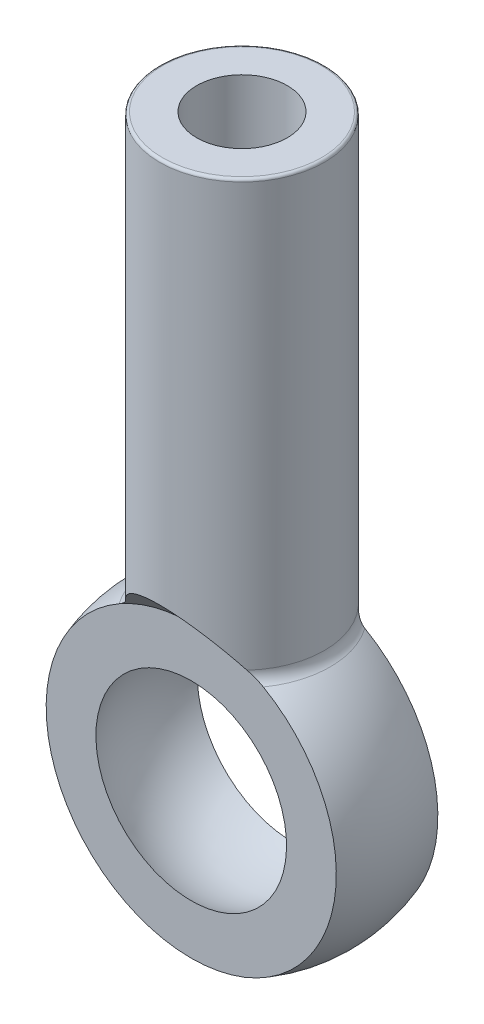
ISO-10303-21;
HEADER;
FILE_DESCRIPTION(('STEP AP214'),'2;1');
FILE_NAME('part.step','',(''),(''),'','','');
FILE_SCHEMA(('AUTOMOTIVE_DESIGN { 1 0 10303 214 1 1 1 1 }'));
ENDSEC;
DATA;
#1=APPLICATION_CONTEXT('core data for automotive mechanical design processes');
#2=APPLICATION_PROTOCOL_DEFINITION('international standard','automotive_design',2000,#1);
#3=PRODUCT_CONTEXT('',#1,'mechanical');
#4=PRODUCT('Part','Part','',(#3));
#5=PRODUCT_RELATED_PRODUCT_CATEGORY('part','',(#4));
#6=PRODUCT_DEFINITION_FORMATION('','',#4);
#7=PRODUCT_DEFINITION_CONTEXT('part definition',#1,'design');
#8=PRODUCT_DEFINITION('design','',#6,#7);
#9=PRODUCT_DEFINITION_SHAPE('','',#8);
#10=(LENGTH_UNIT() NAMED_UNIT(*) SI_UNIT(.MILLI.,.METRE.));
#11=(NAMED_UNIT(*) PLANE_ANGLE_UNIT() SI_UNIT($,.RADIAN.));
#12=(NAMED_UNIT(*) SI_UNIT($,.STERADIAN.) SOLID_ANGLE_UNIT());
#13=UNCERTAINTY_MEASURE_WITH_UNIT(LENGTH_MEASURE(1.E-05),#10,'distance_accuracy_value','');
#14=(GEOMETRIC_REPRESENTATION_CONTEXT(3) GLOBAL_UNCERTAINTY_ASSIGNED_CONTEXT((#13)) GLOBAL_UNIT_ASSIGNED_CONTEXT((#10,
#11,#12)) REPRESENTATION_CONTEXT('',''));
#15=CARTESIAN_POINT('',(0.,0.,0.));
#16=DIRECTION('',(0.,0.,1.));
#17=DIRECTION('',(1.,0.,0.));
#18=AXIS2_PLACEMENT_3D('',#15,#16,#17);
#19=CARTESIAN_POINT('',(0.,-5.60100000000002,0.));
#20=DIRECTION('',(0.,1.,0.));
#21=DIRECTION('',(0.,0.,1.));
#22=AXIS2_PLACEMENT_3D('',#19,#20,#21);
#23=CYLINDRICAL_SURFACE('',#22,3.);
#24=CARTESIAN_POINT('',(0.,20.4,0.));
#25=DIRECTION('',(0.,1.,0.));
#26=DIRECTION('',(0.,0.,1.));
#27=AXIS2_PLACEMENT_3D('',#24,#25,#26);
#28=CIRCLE('',#27,3.);
#29=CARTESIAN_POINT('',(0.,20.4,3.));
#30=VERTEX_POINT('',#29);
#31=EDGE_CURVE('E193',#30,#30,#28,.F.);
#32=ORIENTED_EDGE('',*,*,#31,.T.);
#33=EDGE_LOOP('',(#32));
#34=FACE_BOUND('',#33,.T.);
#35=CARTESIAN_POINT('',(2.44602412682537,4.55764042091961,-1.73694155658394));
#36=CARTESIAN_POINT('',(2.40024699118172,4.65528738705973,-1.80135420225148));
#37=CARTESIAN_POINT('',(2.35107082688438,4.75176667393299,-1.8652601699289));
#38=CARTESIAN_POINT('',(2.24504764663498,4.94192204966051,-1.99164213423625));
#39=CARTESIAN_POINT('',(2.18817632060194,5.03558805605593,-2.05411283373368));
#40=CARTESIAN_POINT('',(2.065388779281,5.22019216431228,-2.17757534889617));
#41=CARTESIAN_POINT('',(1.9993651671368,5.31107936578248,-2.23853761703539));
#42=CARTESIAN_POINT('',(1.85807132661981,5.48748542198404,-2.35713248808425));
#43=CARTESIAN_POINT('',(1.78281428518668,5.57301167511847,-2.41476967063122));
#44=CARTESIAN_POINT('',(1.61727835978782,5.74198420783052,-2.52885273648694));
#45=CARTESIAN_POINT('',(1.52637597661213,5.82501167258094,-2.5850287621427));
#46=CARTESIAN_POINT('',(1.33223674939199,5.98025978098959,-2.69022793969352));
#47=CARTESIAN_POINT('',(1.22902332123154,6.05250037003263,-2.73926428885861));
#48=CARTESIAN_POINT('',(1.00785215259881,6.18334202748633,-2.82817579205946));
#49=CARTESIAN_POINT('',(0.889693567413791,6.24171829613962,-2.86789983612999));
#50=CARTESIAN_POINT('',(0.703876593955193,6.31376845861247,-2.91696200747435));
#51=CARTESIAN_POINT('',(0.640551249727053,6.33519066779155,-2.93155606918036));
#52=CARTESIAN_POINT('',(0.511484936846344,6.37224502719385,-2.95680640498372));
#53=CARTESIAN_POINT('',(0.445745232155979,6.38788016086986,-2.96746470810444));
#54=CARTESIAN_POINT('',(0.28505371296226,6.41789123734155,-2.98792594289107));
#55=CARTESIAN_POINT('',(0.18919987239285,6.42910892861182,-2.99557716349875));
#56=CARTESIAN_POINT('',(-0.00338252106644028,6.43785863240115,-3.00154480540944));
#57=CARTESIAN_POINT('',(-0.100110772347433,6.43539519664305,-2.99986433137538));
#58=CARTESIAN_POINT('',(-0.291482826134028,6.41703538830415,-2.98734323740458));
#59=CARTESIAN_POINT('',(-0.386129936671219,6.4011621962858,-2.97651842468568));
#60=CARTESIAN_POINT('',(-0.571186897211008,6.3572962402258,-2.94661794994415));
#61=CARTESIAN_POINT('',(-0.661593999382848,6.32929573388685,-2.92753701707234));
#62=CARTESIAN_POINT('',(-0.868663474402699,6.25087803409788,-2.87413503269833));
#63=CARTESIAN_POINT('',(-0.982853168539536,6.19600855473055,-2.83679302201911));
#64=CARTESIAN_POINT('',(-1.19912288765179,6.07182904256509,-2.75239124631842));
#65=CARTESIAN_POINT('',(-1.30117579428091,6.00248759124179,-2.70531034024588));
#66=CARTESIAN_POINT('',(-1.54412887500798,5.81386312608104,-2.5774505778385));
#67=CARTESIAN_POINT('',(-1.67706056407422,5.68755209964437,-2.49201138082646));
#68=CARTESIAN_POINT('',(-1.91850373352036,5.41947818060445,-2.31131222685422));
#69=CARTESIAN_POINT('',(-2.0269413616641,5.27767042171176,-2.21602379987247));
#70=CARTESIAN_POINT('',(-2.18642804189703,5.03841487166648,-2.05599898054649));
#71=CARTESIAN_POINT('',(-2.24387021045847,4.94395556214009,-1.9929955287411));
#72=CARTESIAN_POINT('',(-2.35065088855696,4.75259605133688,-1.86580957838995));
#73=CARTESIAN_POINT('',(-2.40004907213855,4.6557206143549,-1.80164009762895));
#74=CARTESIAN_POINT('',(-2.44602412682537,4.55764042091961,-1.73694155658455));
#75=B_SPLINE_CURVE_WITH_KNOTS('',3,(#35,#36,#37,#38,#39,#40,#41,#42,#43,#44,#45,#46,#47,#48,#49,
#50,#51,#52,#53,#54,#55,#56,#57,#58,#59,#60,#61,#62,#63,#64,#65,#66,#67,#68,#69,#70,#71,#72,#73,
#74),.UNSPECIFIED.,.F.,.F.,(4,2,2,2,2,2,2,2,2,2,2,2,2,2,2,2,2,2,2,4),(0.,0.376902116192524,
0.755023998504271,1.13803272365104,1.52050067769538,1.92548327434444,2.32970751299637,
2.7400960849395,2.94502683597151,3.14985178993383,3.43885430817985,3.72776068079855,
4.01616865948594,4.30476103508917,4.69877211254722,5.09364765232536,5.69718424084918,
6.30251696324926,6.68399467053855,7.06249895359513),.UNSPECIFIED.);
#76=CARTESIAN_POINT('',(2.21092766784287,4.99599839871873,-2.02775709777253));
#77=VERTEX_POINT('',#76);
#78=CARTESIAN_POINT('',(-2.21092766784342,4.995998398718,-2.0277570977727));
#79=VERTEX_POINT('',#78);
#80=EDGE_CURVE('E99',#77,#79,#75,.T.);
#81=ORIENTED_EDGE('',*,*,#80,.T.);
#82=CARTESIAN_POINT('',(0.,4.99599839871873,0.));
#83=DIRECTION('',(0.,-1.,0.));
#84=DIRECTION('',(0.,0.,-1.));
#85=AXIS2_PLACEMENT_3D('',#82,#83,#84);
#86=CIRCLE('',#85,3.);
#87=CARTESIAN_POINT('',(-2.21092766784342,4.995998398718,2.02775709777137));
#88=VERTEX_POINT('',#87);
#89=EDGE_CURVE('E186',#79,#88,#86,.F.);
#90=ORIENTED_EDGE('',*,*,#89,.T.);
#91=CARTESIAN_POINT('',(2.44602412682537,4.55764042091961,1.73694155658388));
#92=CARTESIAN_POINT('',(2.40024699118172,4.65528738705971,1.80135420225145));
#93=CARTESIAN_POINT('',(2.35107082688439,4.75176667393297,1.86526016992887));
#94=CARTESIAN_POINT('',(2.245047646635,4.94192204966048,1.99164213423623));
#95=CARTESIAN_POINT('',(2.18817632060196,5.03558805605589,2.05411283373366));
#96=CARTESIAN_POINT('',(2.06538877928102,5.22019216431225,2.17757534889615));
#97=CARTESIAN_POINT('',(1.99936516713682,5.31107936578245,2.23853761703538));
#98=CARTESIAN_POINT('',(1.85807132661981,5.48748542198403,2.35713248808425));
#99=CARTESIAN_POINT('',(1.78281428518668,5.57301167511847,2.41476967063121));
#100=CARTESIAN_POINT('',(1.61727835978782,5.74198420783052,2.52885273648694));
#101=CARTESIAN_POINT('',(1.52637597661214,5.82501167258092,2.5850287621427));
#102=CARTESIAN_POINT('',(1.33223674939201,5.98025978098958,2.6902279396935));
#103=CARTESIAN_POINT('',(1.22902332123158,6.05250037003263,2.73926428885856));
#104=CARTESIAN_POINT('',(1.00785215259886,6.18334202748633,2.82817579205941));
#105=CARTESIAN_POINT('',(0.889693567413841,6.2417182961396,2.86789983612996));
#106=CARTESIAN_POINT('',(0.703876593955234,6.31376845861245,2.91696200747435));
#107=CARTESIAN_POINT('',(0.640551249727088,6.33519066779154,2.93155606918036));
#108=CARTESIAN_POINT('',(0.511484936846363,6.37224502719385,2.95680640498371));
#109=CARTESIAN_POINT('',(0.445745232155989,6.38788016086986,2.96746470810444));
#110=CARTESIAN_POINT('',(0.285053712962261,6.41789123734155,2.98792594289107));
#111=CARTESIAN_POINT('',(0.189199872392848,6.42910892861182,2.99557716349877));
#112=CARTESIAN_POINT('',(-0.00338252106641402,6.43785863240115,3.00154480540942));
#113=CARTESIAN_POINT('',(-0.100110772347376,6.43539519664305,2.99986433137529));
#114=CARTESIAN_POINT('',(-0.291482826134026,6.41703538830414,2.98734323740466));
#115=CARTESIAN_POINT('',(-0.3861299366713,6.40116219628577,2.97651842468599));
#116=CARTESIAN_POINT('',(-0.571186897211041,6.35729624022579,2.94661794994382));
#117=CARTESIAN_POINT('',(-0.661593999382749,6.32929573388689,2.92753701707113));
#118=CARTESIAN_POINT('',(-0.868663474402666,6.25087803409785,2.87413503269684));
#119=CARTESIAN_POINT('',(-0.982853168539857,6.19600855473035,2.83679302201887));
#120=CARTESIAN_POINT('',(-1.19912288765214,6.07182904256491,2.7523912463184));
#121=CARTESIAN_POINT('',(-1.30117579428093,6.00248759124179,2.70531034024481));
#122=CARTESIAN_POINT('',(-1.5441288750078,5.81386312608105,2.57745057783676));
#123=CARTESIAN_POINT('',(-1.67706056407451,5.68755209964398,2.49201138082612));
#124=CARTESIAN_POINT('',(-1.91850373352072,5.41947818060411,2.31131222685407));
#125=CARTESIAN_POINT('',(-2.02694136166408,5.27767042171188,2.21602379987109));
#126=CARTESIAN_POINT('',(-2.18642804189705,5.03841487166641,2.05599898054528));
#127=CARTESIAN_POINT('',(-2.24387021045866,4.94395556213973,1.99299552874049));
#128=CARTESIAN_POINT('',(-2.35065088855731,4.75259605133626,1.8658095783899));
#129=CARTESIAN_POINT('',(-2.4000490721389,4.65572061435432,1.80164009762886));
#130=CARTESIAN_POINT('',(-2.44602412682537,4.55764042091961,1.73694155658327));
#131=B_SPLINE_CURVE_WITH_KNOTS('',3,(#91,#92,#93,#94,#95,#96,#97,#98,#99,#100,#101,#102,#103,
#104,#105,#106,#107,#108,#109,#110,#111,#112,#113,#114,#115,#116,#117,#118,#119,#120,#121,#122,
#123,#124,#125,#126,#127,#128,#129,#130),.UNSPECIFIED.,.F.,.F.,(4,2,2,2,2,2,2,2,2,2,2,2,2,2,2,2,
2,2,2,4),(0.,0.376902116192513,0.755023998504251,1.13803272365105,1.5205006776954,
1.92548327434445,2.32970751299633,2.74009608493947,2.94502683597151,3.14985178993386,
3.43885430817987,3.72776068079852,4.01616865948602,4.30476103508941,4.69877211254755,
5.0936476523257,5.69718424084952,6.30251696324968,6.683994670539,7.06249895359556),.UNSPECIFIED.);
#132=CARTESIAN_POINT('',(2.21092766784287,4.99599839871873,2.02775709777253));
#133=VERTEX_POINT('',#132);
#134=EDGE_CURVE('E103',#133,#88,#131,.T.);
#135=ORIENTED_EDGE('',*,*,#134,.F.);
#136=CARTESIAN_POINT('',(0.,4.99599839871873,0.));
#137=DIRECTION('',(0.,-1.,0.));
#138=DIRECTION('',(0.,0.,-1.));
#139=AXIS2_PLACEMENT_3D('',#136,#137,#138);
#140=CIRCLE('',#139,3.);
#141=EDGE_CURVE('E189',#133,#77,#140,.F.);
#142=ORIENTED_EDGE('',*,*,#141,.T.);
#143=EDGE_LOOP('',(#81,#90,#135,#142));
#144=FACE_BOUND('',#143,.T.);
#145=ADVANCED_FACE('F48',(#34,#144),#23,.T.);
#146=CARTESIAN_POINT('',(0.,0.,0.));
#147=DIRECTION('',(0.,0.,1.));
#148=DIRECTION('',(0.,1.,0.));
#149=AXIS2_PLACEMENT_3D('',#146,#147,#148);
#150=SPHERICAL_SURFACE('',#149,5.6);
#151=CARTESIAN_POINT('',(0.,0.,1.85000000000002));
#152=DIRECTION('',(0.,0.,1.));
#153=DIRECTION('',(1.,0.,0.));
#154=AXIS2_PLACEMENT_3D('',#151,#152,#153);
#155=CIRCLE('',#154,5.2855936279665);
#156=CARTESIAN_POINT('',(-2.62709086691049,4.58649033324998,1.84999999999935));
#157=VERTEX_POINT('',#156);
#158=CARTESIAN_POINT('',(2.62709086691049,4.58649033324998,1.85000000000002));
#159=VERTEX_POINT('',#158);
#160=EDGE_CURVE('E206',#157,#159,#155,.T.);
#161=ORIENTED_EDGE('',*,*,#160,.F.);
#162=CARTESIAN_POINT('',(0.,4.58649033324998,0.));
#163=DIRECTION('',(0.,-1.,0.));
#164=DIRECTION('',(0.,0.,-1.));
#165=AXIS2_PLACEMENT_3D('',#162,#163,#164);
#166=CIRCLE('',#165,3.21311475409836);
#167=CARTESIAN_POINT('',(-2.62709086691049,4.58649033324998,-1.85000000000068));
#168=VERTEX_POINT('',#167);
#169=EDGE_CURVE('E185',#157,#168,#166,.T.);
#170=ORIENTED_EDGE('',*,*,#169,.T.);
#171=CARTESIAN_POINT('',(0.,0.,-1.85000000000002));
#172=DIRECTION('',(0.,0.,1.));
#173=DIRECTION('',(1.,0.,0.));
#174=AXIS2_PLACEMENT_3D('',#171,#172,#173);
#175=CIRCLE('',#174,5.2855936279665);
#176=CARTESIAN_POINT('',(2.62709086691049,4.58649033324998,-1.85000000000002));
#177=VERTEX_POINT('',#176);
#178=EDGE_CURVE('E199',#168,#177,#175,.T.);
#179=ORIENTED_EDGE('',*,*,#178,.T.);
#180=CARTESIAN_POINT('',(0.,4.58649033324998,0.));
#181=DIRECTION('',(0.,-1.,0.));
#182=DIRECTION('',(0.,0.,-1.));
#183=AXIS2_PLACEMENT_3D('',#180,#181,#182);
#184=CIRCLE('',#183,3.21311475409836);
#185=EDGE_CURVE('E182',#177,#159,#184,.T.);
#186=ORIENTED_EDGE('',*,*,#185,.T.);
#187=EDGE_LOOP('',(#161,#170,#179,#186));
#188=FACE_BOUND('',#187,.T.);
#189=ADVANCED_FACE('F131',(#188),#150,.T.);
#190=CARTESIAN_POINT('',(0.,3.47299942412893,-1.85000000000002));
#191=DIRECTION('',(0.,0.,1.));
#192=DIRECTION('',(1.,0.,0.));
#193=AXIS2_PLACEMENT_3D('',#190,#191,#192);
#194=PLANE('',#193);
#195=EDGE_CURVE('E68',#177,#168,#175,.T.);
#196=ORIENTED_EDGE('',*,*,#195,.F.);
#197=ORIENTED_EDGE('',*,*,#178,.F.);
#198=EDGE_LOOP('',(#196,#197));
#199=FACE_BOUND('',#198,.T.);
#200=CARTESIAN_POINT('',(0.,0.,-1.85000000000002));
#201=DIRECTION('',(0.,0.,1.));
#202=DIRECTION('',(1.,0.,0.));
#203=AXIS2_PLACEMENT_3D('',#200,#201,#202);
#204=CIRCLE('',#203,3.47299942412895);
#205=CARTESIAN_POINT('',(0.,3.47299942412894,-1.85000000000002));
#206=VERTEX_POINT('',#205);
#207=EDGE_CURVE('E200',#206,#206,#204,.T.);
#208=ORIENTED_EDGE('',*,*,#207,.T.);
#209=EDGE_LOOP('',(#208));
#210=FACE_BOUND('',#209,.T.);
#211=ADVANCED_FACE('F137',(#199,#210),#194,.F.);
#212=CARTESIAN_POINT('',(0.,0.,0.));
#213=DIRECTION('',(0.,0.,1.));
#214=DIRECTION('',(0.,1.,0.));
#215=AXIS2_PLACEMENT_3D('',#212,#213,#214);
#216=SPHERICAL_SURFACE('',#215,3.935);
#217=CARTESIAN_POINT('',(0.,0.,1.85000000000002));
#218=DIRECTION('',(0.,0.,1.));
#219=DIRECTION('',(1.,0.,0.));
#220=AXIS2_PLACEMENT_3D('',#217,#218,#219);
#221=CIRCLE('',#220,3.47299942412895);
#222=CARTESIAN_POINT('',(0.,3.47299942412894,1.85000000000002));
#223=VERTEX_POINT('',#222);
#224=EDGE_CURVE('E203',#223,#223,#221,.T.);
#225=CARTESIAN_POINT('',(0.,3.47299942412894,-1.85000000000002));
#226=CARTESIAN_POINT('',(0.,3.49186379439191,-1.81458641304172));
#227=CARTESIAN_POINT('',(0.,3.51018613981897,-1.77888411225705));
#228=CARTESIAN_POINT('',(0.,3.54573044864856,-1.70693589121255));
#229=CARTESIAN_POINT('',(0.,3.56295241205111,-1.67068997095273));
#230=CARTESIAN_POINT('',(0.,3.59627962447903,-1.59768831913556));
#231=CARTESIAN_POINT('',(0.,3.61238487350441,-1.56093258757822));
#232=CARTESIAN_POINT('',(0.,3.64346364563702,-1.48694573467696));
#233=CARTESIAN_POINT('',(0.,3.65843716874426,-1.44971461333305));
#234=CARTESIAN_POINT('',(0.,3.68723846254222,-1.37481181067575));
#235=CARTESIAN_POINT('',(0.,3.70106623323295,-1.33714012936236));
#236=CARTESIAN_POINT('',(0.,3.72756308759968,-1.26139145860531));
#237=CARTESIAN_POINT('',(0.,3.74023217127567,-1.22331446916166));
#238=CARTESIAN_POINT('',(0.,3.76439979590223,-1.14679081061212));
#239=CARTESIAN_POINT('',(0.,3.7758983368528,-1.10834414150624));
#240=CARTESIAN_POINT('',(0.,3.79771411702859,-1.03111709871584));
#241=CARTESIAN_POINT('',(0.,3.80803135625382,-0.992336725031327));
#242=CARTESIAN_POINT('',(0.,3.82747487895382,-0.914478560229745));
#243=CARTESIAN_POINT('',(0.,3.83660116242861,-0.875400769112676));
#244=CARTESIAN_POINT('',(0.,3.85365423409406,-0.796984334938983));
#245=CARTESIAN_POINT('',(0.,3.86158102228472,-0.757645691882359));
#246=CARTESIAN_POINT('',(0.,3.87622768620067,-0.678744363390825));
#247=CARTESIAN_POINT('',(0.,3.88294756192595,-0.639181677955915));
#248=CARTESIAN_POINT('',(0.,3.89517411305735,-0.559869283911408));
#249=CARTESIAN_POINT('',(0.,3.90068078846348,-0.520119575301811));
#250=CARTESIAN_POINT('',(0.,3.91047578630457,-0.440470329110024));
#251=CARTESIAN_POINT('',(0.,3.91476410873953,-0.400570791527834));
#252=CARTESIAN_POINT('',(0.,3.92211838801197,-0.320659221789693));
#253=CARTESIAN_POINT('',(0.,3.92518434484943,-0.280647189633742));
#254=CARTESIAN_POINT('',(0.,3.93009102408018,-0.200548070409145));
#255=CARTESIAN_POINT('',(0.,3.93193174647346,-0.160460983340499));
#256=CARTESIAN_POINT('',(0.,3.93438623443337,-0.0802492641812358));
#257=CARTESIAN_POINT('',(0.,3.935,-0.0401246320906178));
#258=CARTESIAN_POINT('',(0.,3.935,0.0401246320906182));
#259=CARTESIAN_POINT('',(0.,3.93438623443337,0.0802492641812361));
#260=CARTESIAN_POINT('',(0.,3.93193174647346,0.1604609833405));
#261=CARTESIAN_POINT('',(0.,3.93009102408018,0.200548070409145));
#262=CARTESIAN_POINT('',(0.,3.92518434484943,0.280647189633742));
#263=CARTESIAN_POINT('',(0.,3.92211838801197,0.320659221789693));
#264=CARTESIAN_POINT('',(0.,3.91476410873953,0.400570791527834));
#265=CARTESIAN_POINT('',(0.,3.91047578630457,0.440470329110024));
#266=CARTESIAN_POINT('',(0.,3.90068078846348,0.520119575301811));
#267=CARTESIAN_POINT('',(0.,3.89517411305735,0.559869283911408));
#268=CARTESIAN_POINT('',(0.,3.88294756192595,0.639181677955915));
#269=CARTESIAN_POINT('',(0.,3.87622768620067,0.678744363390825));
#270=CARTESIAN_POINT('',(0.,3.86158102228472,0.757645691882359));
#271=CARTESIAN_POINT('',(0.,3.85365423409406,0.796984334938983));
#272=CARTESIAN_POINT('',(0.,3.83660116242861,0.875400769112676));
#273=CARTESIAN_POINT('',(0.,3.82747487895382,0.914478560229745));
#274=CARTESIAN_POINT('',(0.,3.80803135625382,0.992336725031327));
#275=CARTESIAN_POINT('',(0.,3.79771411702859,1.03111709871584));
#276=CARTESIAN_POINT('',(0.,3.7758983368528,1.10834414150624));
#277=CARTESIAN_POINT('',(0.,3.76439979590223,1.14679081061212));
#278=CARTESIAN_POINT('',(0.,3.74023217127567,1.22331446916166));
#279=CARTESIAN_POINT('',(0.,3.72756308759968,1.26139145860531));
#280=CARTESIAN_POINT('',(0.,3.70106623323295,1.33714012936236));
#281=CARTESIAN_POINT('',(0.,3.68723846254222,1.37481181067575));
#282=CARTESIAN_POINT('',(0.,3.65843716874426,1.44971461333305));
#283=CARTESIAN_POINT('',(0.,3.64346364563702,1.48694573467696));
#284=CARTESIAN_POINT('',(0.,3.61238487350441,1.56093258757822));
#285=CARTESIAN_POINT('',(0.,3.59627962447903,1.59768831913556));
#286=CARTESIAN_POINT('',(0.,3.56295241205111,1.67068997095273));
#287=CARTESIAN_POINT('',(0.,3.54573044864856,1.70693589121255));
#288=CARTESIAN_POINT('',(0.,3.51018613981896,1.77888411225705));
#289=CARTESIAN_POINT('',(0.,3.49186379439191,1.81458641304172));
#290=CARTESIAN_POINT('',(0.,3.47299942412894,1.85000000000002));
#291=B_SPLINE_CURVE_WITH_KNOTS('',3,(#225,#226,#227,#228,#229,#230,#231,#232,#233,#234,#235,
#236,#237,#238,#239,#240,#241,#242,#243,#244,#245,#246,#247,#248,#249,#250,#251,#252,#253,#254,
#255,#256,#257,#258,#259,#260,#261,#262,#263,#264,#265,#266,#267,#268,#269,#270,#271,#272,#273,
#274,#275,#276,#277,#278,#279,#280,#281,#282,#283,#284,#285,#286,#287,#288,#289,#290),
.UNSPECIFIED.,.F.,.F.,(4,2,2,2,2,2,2,2,2,2,2,2,2,2,2,2,2,2,2,2,2,2,2,2,2,2,2,2,2,2,2,2,4),(0.,
0.120369203418667,0.240738406837334,0.361107610256001,0.481476813674668,0.601846017093335,
0.722215220512002,0.842584423930669,0.962953627349336,1.083322830768,1.20369203418667,
1.32406123760534,1.444430441024,1.56479964444267,1.68516884786134,1.80553805128001,
1.92590725469867,2.04627645811734,2.16664566153601,2.28701486495467,2.40738406837334,
2.52775327179201,2.64812247521067,2.76849167862934,2.88886088204801,3.00923008546667,
3.12959928888534,3.24996849230401,3.37033769572268,3.49070689914134,3.61107610256001,
3.73144530597868,3.85181450939734),.UNSPECIFIED.);
#292=EDGE_CURVE('BSEAM148',#206,#223,#291,.T.);
#293=ORIENTED_EDGE('',*,*,#207,.F.);
#294=ORIENTED_EDGE('',*,*,#224,.T.);
#295=ORIENTED_EDGE('',*,*,#292,.T.);
#296=ORIENTED_EDGE('',*,*,#292,.F.);
#297=EDGE_LOOP('',(#293,#295,#294,#296));
#298=FACE_BOUND('',#297,.T.);
#299=ADVANCED_FACE('F148',(#298),#216,.F.);
#300=CARTESIAN_POINT('',(0.,5.28559362796649,1.85000000000002));
#301=DIRECTION('',(0.,0.,-1.));
#302=DIRECTION('',(-1.,0.,0.));
#303=AXIS2_PLACEMENT_3D('',#300,#301,#302);
#304=PLANE('',#303);
#305=ORIENTED_EDGE('',*,*,#224,.F.);
#306=EDGE_LOOP('',(#305));
#307=FACE_BOUND('',#306,.T.);
#308=EDGE_CURVE('E205',#159,#157,#155,.T.);
#309=ORIENTED_EDGE('',*,*,#308,.T.);
#310=ORIENTED_EDGE('',*,*,#160,.T.);
#311=EDGE_LOOP('',(#309,#310));
#312=FACE_BOUND('',#311,.T.);
#313=ADVANCED_FACE('F145',(#307,#312),#304,.F.);
#314=CARTESIAN_POINT('',(0.,20.5,0.));
#315=DIRECTION('',(0.,1.,0.));
#316=DIRECTION('',(0.,0.,1.));
#317=AXIS2_PLACEMENT_3D('',#314,#315,#316);
#318=PLANE('',#317);
#319=CARTESIAN_POINT('',(0.,20.5,0.));
#320=DIRECTION('',(0.,1.,0.));
#321=DIRECTION('',(0.,0.,1.));
#322=AXIS2_PLACEMENT_3D('',#319,#320,#321);
#323=CIRCLE('',#322,2.9);
#324=CARTESIAN_POINT('',(0.,20.5,2.9));
#325=VERTEX_POINT('',#324);
#326=EDGE_CURVE('E195',#325,#325,#323,.T.);
#327=ORIENTED_EDGE('',*,*,#326,.T.);
#328=EDGE_LOOP('',(#327));
#329=FACE_BOUND('',#328,.T.);
#330=CARTESIAN_POINT('',(0.,20.5,0.));
#331=DIRECTION('',(0.,1.,0.));
#332=DIRECTION('',(0.,0.,1.));
#333=AXIS2_PLACEMENT_3D('',#330,#331,#332);
#334=CIRCLE('',#333,1.65);
#335=CARTESIAN_POINT('',(0.,20.5,1.65));
#336=VERTEX_POINT('',#335);
#337=EDGE_CURVE('E100',#336,#336,#334,.T.);
#338=ORIENTED_EDGE('',*,*,#337,.F.);
#339=EDGE_LOOP('',(#338));
#340=FACE_BOUND('',#339,.T.);
#341=ADVANCED_FACE('F144',(#329,#340),#318,.T.);
#342=CARTESIAN_POINT('',(0.,0.,1.85000000000002));
#343=DIRECTION('',(0.,0.,1.));
#344=DIRECTION('',(1.,0.,0.));
#345=AXIS2_PLACEMENT_3D('',#342,#343,#344);
#346=CONICAL_SURFACE('',#345,5.2855936279665,0.78539816339745);
#347=ORIENTED_EDGE('',*,*,#308,.F.);
#348=CARTESIAN_POINT('',(2.62709086691049,4.58649033324998,1.85000000000002));
#349=CARTESIAN_POINT('',(2.60833566328409,4.59723752076093,1.85000261769329));
#350=CARTESIAN_POINT('',(2.58998737990976,4.60862535193725,1.85089850313281));
#351=CARTESIAN_POINT('',(2.55418458528277,4.63243177411821,1.854286114044));
#352=CARTESIAN_POINT('',(2.53672804649743,4.64484784164048,1.85677402783446));
#353=CARTESIAN_POINT('',(2.48649547505242,4.6827346331652,1.86619602564429));
#354=CARTESIAN_POINT('',(2.45496198387405,4.70937725018632,1.87510796364288));
#355=CARTESIAN_POINT('',(2.40394665701997,4.7567237043326,1.89400267001358));
#356=CARTESIAN_POINT('',(2.38359809314564,4.77694563615719,1.90294946617003));
#357=CARTESIAN_POINT('',(2.34466530125521,4.81817764013932,1.92272568762823));
#358=CARTESIAN_POINT('',(2.32608186655966,4.8391880608128,1.93355595330496));
#359=CARTESIAN_POINT('',(2.29011014761628,4.88254953992203,1.95729237594099));
#360=CARTESIAN_POINT('',(2.27278695715877,4.90492175611758,1.97025818455114));
#361=CARTESIAN_POINT('',(2.24024979018547,4.95013531054252,1.99781885402314));
#362=CARTESIAN_POINT('',(2.22503309484836,4.97297599954079,2.01241157027524));
#363=CARTESIAN_POINT('',(2.21092766784287,4.99599839871873,2.02775709777253));
#364=B_SPLINE_CURVE_WITH_KNOTS('',3,(#348,#349,#350,#351,#352,#353,#354,#355,#356,#357,#358,
#359,#360,#361,#362,#363),.UNSPECIFIED.,.F.,.F.,(4,2,2,2,2,2,2,4),(0.,0.0647625566014219,
0.129370633996034,0.255506395483884,0.345551916836608,0.435637718674761,0.528894500277026,
0.622029771589929),.UNSPECIFIED.);
#365=EDGE_CURVE('E13',#159,#133,#364,.T.);
#366=ORIENTED_EDGE('',*,*,#365,.T.);
#367=ORIENTED_EDGE('',*,*,#134,.T.);
#368=CARTESIAN_POINT('',(-2.21092766784375,4.99599839871873,2.02775709777092));
#369=CARTESIAN_POINT('',(-2.22468696128107,4.9735384440957,2.01278590125856));
#370=CARTESIAN_POINT('',(-2.23950536041199,4.95125214675897,1.99853235304306));
#371=CARTESIAN_POINT('',(-2.27114441060224,4.9071265483781,1.9715714503448));
#372=CARTESIAN_POINT('',(-2.28796715381552,4.88528774278578,1.9588657399792));
#373=CARTESIAN_POINT('',(-2.32288419174761,4.84291479768925,1.93553449968114));
#374=CARTESIAN_POINT('',(-2.34091828349931,4.82236138219802,1.92485420109991));
#375=CARTESIAN_POINT('',(-2.37867315398254,4.78199011514535,1.90527206141072));
#376=CARTESIAN_POINT('',(-2.39839342078188,4.76217204293139,1.89636968323495));
#377=CARTESIAN_POINT('',(-2.44950363560275,4.7141016087586,1.87677023106978));
#378=CARTESIAN_POINT('',(-2.48192614690854,4.68640371386848,1.86728625267848));
#379=CARTESIAN_POINT('',(-2.53369583751169,4.64703753144617,1.85724086477894));
#380=CARTESIAN_POINT('',(-2.55171268032525,4.63413688392218,1.85458361479904));
#381=CARTESIAN_POINT('',(-2.58870263028137,4.60942414257496,1.85096255677192));
#382=CARTESIAN_POINT('',(-2.60767805591642,4.59761490467512,1.85000307869794));
#383=CARTESIAN_POINT('',(-2.62709086691049,4.58649033324998,1.84999999999935));
#384=B_SPLINE_CURVE_WITH_KNOTS('',3,(#368,#369,#370,#371,#372,#373,#374,#375,#376,#377,#378,
#379,#380,#381,#382,#383),.UNSPECIFIED.,.F.,.F.,(4,2,2,2,2,2,2,4),(0.,0.0908592297204735,
0.181814144048781,0.269770533088721,0.357700312256372,0.488140294514211,0.554996778614417,
0.622023528103789),.UNSPECIFIED.);
#385=EDGE_CURVE('E159',#88,#157,#384,.T.);
#386=ORIENTED_EDGE('',*,*,#385,.T.);
#387=EDGE_LOOP('',(#347,#366,#367,#386));
#388=FACE_BOUND('',#387,.T.);
#389=ADVANCED_FACE('F213',(#388),#346,.F.);
#390=CARTESIAN_POINT('',(0.,0.,-1.85000000000002));
#391=DIRECTION('',(0.,0.,-1.));
#392=DIRECTION('',(1.,0.,0.));
#393=AXIS2_PLACEMENT_3D('',#390,#391,#392);
#394=CONICAL_SURFACE('',#393,5.2855936279665,0.78539816339745);
#395=ORIENTED_EDGE('',*,*,#195,.T.);
#396=CARTESIAN_POINT('',(-2.62709086691049,4.58649033324998,-1.85000000000068));
#397=CARTESIAN_POINT('',(-2.60833566328406,4.59723752076094,-1.85000261769361));
#398=CARTESIAN_POINT('',(-2.5899873799097,4.60862535193729,-1.85089850313292));
#399=CARTESIAN_POINT('',(-2.55418458528267,4.63243177411828,-1.85428611404391));
#400=CARTESIAN_POINT('',(-2.53672804649733,4.64484784164055,-1.85677402783438));
#401=CARTESIAN_POINT('',(-2.48649547505236,4.68273463316524,-1.8661960256445));
#402=CARTESIAN_POINT('',(-2.45496198387409,4.70937725018628,-1.87510796364364));
#403=CARTESIAN_POINT('',(-2.40394665701999,4.75672370433259,-1.89400267001416));
#404=CARTESIAN_POINT('',(-2.38359809314561,4.77694563615722,-1.9029494661702));
#405=CARTESIAN_POINT('',(-2.34466530125521,4.81817764013932,-1.92272568762807));
#406=CARTESIAN_POINT('',(-2.32608186655973,4.83918806081271,-1.93355595330489));
#407=CARTESIAN_POINT('',(-2.29011014761645,4.88254953992181,-1.9572923759409));
#408=CARTESIAN_POINT('',(-2.27278695715898,4.90492175611731,-1.97025818455094));
#409=CARTESIAN_POINT('',(-2.24024979018576,4.9501353105421,-1.99781885402292));
#410=CARTESIAN_POINT('',(-2.22503309484869,4.97297599954028,-2.0124115702751));
#411=CARTESIAN_POINT('',(-2.21092766784331,4.995998398718,-2.02775709777275));
#412=B_SPLINE_CURVE_WITH_KNOTS('',3,(#396,#397,#398,#399,#400,#401,#402,#403,#404,#405,#406,
#407,#408,#409,#410,#411),.UNSPECIFIED.,.F.,.F.,(4,2,2,2,2,2,2,4),(0.,0.0647625566015052,
0.129370633996102,0.255506395483996,0.345551916836554,0.435637718674475,0.528894500276443,
0.622029771589199),.UNSPECIFIED.);
#413=EDGE_CURVE('E165',#168,#79,#412,.T.);
#414=ORIENTED_EDGE('',*,*,#413,.T.);
#415=ORIENTED_EDGE('',*,*,#80,.F.);
#416=CARTESIAN_POINT('',(2.21092766784287,4.99599839871873,-2.02775709777253));
#417=CARTESIAN_POINT('',(2.22468696128045,4.97353844409614,-2.01278590125937));
#418=CARTESIAN_POINT('',(2.23950536041152,4.95125214675951,-1.99853235304352));
#419=CARTESIAN_POINT('',(2.27114441060198,4.90712654837857,-1.97157145034495));
#420=CARTESIAN_POINT('',(2.28796715381531,4.88528774278608,-1.95886573997938));
#421=CARTESIAN_POINT('',(2.32288419174751,4.84291479768933,-1.93553449968117));
#422=CARTESIAN_POINT('',(2.34091828349928,4.82236138219804,-1.92485420109977));
#423=CARTESIAN_POINT('',(2.37867315398277,4.78199011514512,-1.90527206141076));
#424=CARTESIAN_POINT('',(2.39839342078229,4.76217204293096,-1.89636968323533));
#425=CARTESIAN_POINT('',(2.44950363560327,4.7141016087581,-1.8767702310704));
#426=CARTESIAN_POINT('',(2.4819261469089,4.68640371386819,-1.86728625267859));
#427=CARTESIAN_POINT('',(2.53369583751188,4.64703753144604,-1.85724086477881));
#428=CARTESIAN_POINT('',(2.55171268032539,4.63413688392209,-1.85458361479891));
#429=CARTESIAN_POINT('',(2.58870263028143,4.60942414257492,-1.85096255677203));
#430=CARTESIAN_POINT('',(2.60767805591645,4.59761490467509,-1.85000307869826));
#431=CARTESIAN_POINT('',(2.62709086691049,4.58649033324998,-1.85000000000002));
#432=B_SPLINE_CURVE_WITH_KNOTS('',3,(#416,#417,#418,#419,#420,#421,#422,#423,#424,#425,#426,
#427,#428,#429,#430,#431),.UNSPECIFIED.,.F.,.F.,(4,2,2,2,2,2,2,4),(0.,0.0908592297209958,
0.181814144049703,0.269770533090055,0.357700312258177,0.488140294515662,0.554996778615648,
0.622023528104896),.UNSPECIFIED.);
#433=EDGE_CURVE('E62',#77,#177,#432,.T.);
#434=ORIENTED_EDGE('',*,*,#433,.T.);
#435=EDGE_LOOP('',(#395,#414,#415,#434));
#436=FACE_BOUND('',#435,.T.);
#437=ADVANCED_FACE('F93',(#436),#394,.F.);
#438=CARTESIAN_POINT('',(0.,6.50000000000001,0.));
#439=DIRECTION('',(0.,1.,0.));
#440=DIRECTION('',(0.,0.,1.));
#441=AXIS2_PLACEMENT_3D('',#438,#439,#440);
#442=CONICAL_SURFACE('',#441,1.65,1.02974425867665);
#443=CARTESIAN_POINT('',(0.,5.50857997860454,0.));
#444=VERTEX_POINT('',#443);
#445=VERTEX_LOOP('',#444);
#446=FACE_BOUND('',#445,.T.);
#447=CARTESIAN_POINT('',(0.,6.50000000000001,0.));
#448=DIRECTION('',(0.,1.,0.));
#449=DIRECTION('',(0.,0.,1.));
#450=AXIS2_PLACEMENT_3D('',#447,#448,#449);
#451=CIRCLE('',#450,1.65);
#452=CARTESIAN_POINT('',(0.,6.50000000000001,1.65));
#453=VERTEX_POINT('',#452);
#454=EDGE_CURVE('E97',#453,#453,#451,.T.);
#455=ORIENTED_EDGE('',*,*,#454,.T.);
#456=EDGE_LOOP('',(#455));
#457=FACE_BOUND('',#456,.T.);
#458=ADVANCED_FACE('F89',(#446,#457),#442,.F.);
#459=CARTESIAN_POINT('',(0.,20.5,0.));
#460=DIRECTION('',(0.,1.,0.));
#461=DIRECTION('',(0.,0.,1.));
#462=AXIS2_PLACEMENT_3D('',#459,#460,#461);
#463=CYLINDRICAL_SURFACE('',#462,1.65);
#464=ORIENTED_EDGE('',*,*,#454,.F.);
#465=EDGE_LOOP('',(#464));
#466=FACE_BOUND('',#465,.T.);
#467=ORIENTED_EDGE('',*,*,#337,.T.);
#468=EDGE_LOOP('',(#467));
#469=FACE_BOUND('',#468,.T.);
#470=ADVANCED_FACE('F92',(#466,#469),#463,.F.);
#471=CARTESIAN_POINT('',(0.,20.4,0.));
#472=DIRECTION('',(0.,1.,0.));
#473=DIRECTION('',(0.,0.,1.));
#474=AXIS2_PLACEMENT_3D('',#471,#472,#473);
#475=TOROIDAL_SURFACE('',#474,2.9,0.1);
#476=ORIENTED_EDGE('',*,*,#31,.F.);
#477=EDGE_LOOP('',(#476));
#478=FACE_BOUND('',#477,.T.);
#479=ORIENTED_EDGE('',*,*,#326,.F.);
#480=EDGE_LOOP('',(#479));
#481=FACE_BOUND('',#480,.T.);
#482=ADVANCED_FACE('F122',(#478,#481),#475,.T.);
#483=CARTESIAN_POINT('',(0.,4.99599839871873,0.));
#484=DIRECTION('',(0.,-1.,0.));
#485=DIRECTION('',(0.,0.,-1.));
#486=AXIS2_PLACEMENT_3D('',#483,#484,#485);
#487=TOROIDAL_SURFACE('',#486,3.5,0.5);
#488=ORIENTED_EDGE('',*,*,#413,.F.);
#489=ORIENTED_EDGE('',*,*,#169,.F.);
#490=ORIENTED_EDGE('',*,*,#385,.F.);
#491=ORIENTED_EDGE('',*,*,#89,.F.);
#492=EDGE_LOOP('',(#488,#489,#490,#491));
#493=FACE_BOUND('',#492,.T.);
#494=ADVANCED_FACE('F126',(#493),#487,.F.);
#495=CARTESIAN_POINT('',(0.,4.99599839871873,0.));
#496=DIRECTION('',(0.,-1.,0.));
#497=DIRECTION('',(0.,0.,-1.));
#498=AXIS2_PLACEMENT_3D('',#495,#496,#497);
#499=TOROIDAL_SURFACE('',#498,3.5,0.5);
#500=ORIENTED_EDGE('',*,*,#365,.F.);
#501=ORIENTED_EDGE('',*,*,#185,.F.);
#502=ORIENTED_EDGE('',*,*,#433,.F.);
#503=ORIENTED_EDGE('',*,*,#141,.F.);
#504=EDGE_LOOP('',(#500,#501,#502,#503));
#505=FACE_BOUND('',#504,.T.);
#506=ADVANCED_FACE('F50',(#505),#499,.F.);
#507=CLOSED_SHELL('',(#145,#189,#211,#299,#313,#341,#389,#437,#458,#470,#482,#494,#506));
#508=MANIFOLD_SOLID_BREP('B2',#507);
#509=ADVANCED_BREP_SHAPE_REPRESENTATION('',(#18,#508),#14);
#510=SHAPE_DEFINITION_REPRESENTATION(#9,#509);
ENDSEC;
END-ISO-10303-21;
